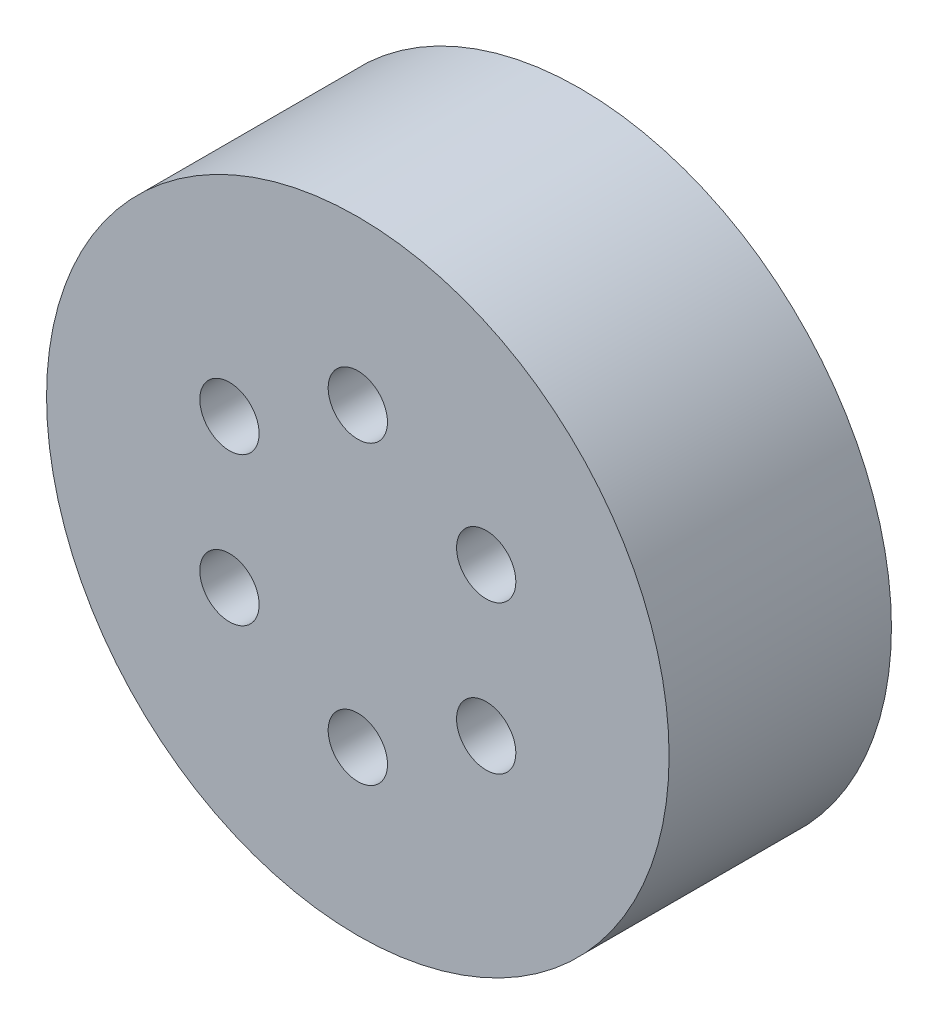
ISO-10303-21;
HEADER;
FILE_DESCRIPTION(('STEP AP214'),'2;1');
FILE_NAME('part.step','',(''),(''),'','','');
FILE_SCHEMA(('AUTOMOTIVE_DESIGN { 1 0 10303 214 1 1 1 1 }'));
ENDSEC;
DATA;
#1=APPLICATION_CONTEXT('core data for automotive mechanical design processes');
#2=APPLICATION_PROTOCOL_DEFINITION('international standard','automotive_design',2000,#1);
#3=PRODUCT_CONTEXT('',#1,'mechanical');
#4=PRODUCT('Part','Part','',(#3));
#5=PRODUCT_RELATED_PRODUCT_CATEGORY('part','',(#4));
#6=PRODUCT_DEFINITION_FORMATION('','',#4);
#7=PRODUCT_DEFINITION_CONTEXT('part definition',#1,'design');
#8=PRODUCT_DEFINITION('design','',#6,#7);
#9=PRODUCT_DEFINITION_SHAPE('','',#8);
#10=(LENGTH_UNIT() NAMED_UNIT(*) SI_UNIT(.MILLI.,.METRE.));
#11=(NAMED_UNIT(*) PLANE_ANGLE_UNIT() SI_UNIT($,.RADIAN.));
#12=(NAMED_UNIT(*) SI_UNIT($,.STERADIAN.) SOLID_ANGLE_UNIT());
#13=UNCERTAINTY_MEASURE_WITH_UNIT(LENGTH_MEASURE(1.E-05),#10,'distance_accuracy_value','');
#14=(GEOMETRIC_REPRESENTATION_CONTEXT(3) GLOBAL_UNCERTAINTY_ASSIGNED_CONTEXT((#13)) GLOBAL_UNIT_ASSIGNED_CONTEXT((#10,
#11,#12)) REPRESENTATION_CONTEXT('',''));
#15=CARTESIAN_POINT('',(0.,0.,0.));
#16=DIRECTION('',(0.,0.,1.));
#17=DIRECTION('',(1.,0.,0.));
#18=AXIS2_PLACEMENT_3D('',#15,#16,#17);
#19=CARTESIAN_POINT('',(0.,0.,15.));
#20=DIRECTION('',(0.,0.,-1.));
#21=DIRECTION('',(-1.,0.,0.));
#22=AXIS2_PLACEMENT_3D('',#19,#20,#21);
#23=CYLINDRICAL_SURFACE('',#22,21.);
#24=CARTESIAN_POINT('',(0.,0.,15.));
#25=DIRECTION('',(0.,0.,1.));
#26=DIRECTION('',(1.,0.,0.));
#27=AXIS2_PLACEMENT_3D('',#24,#25,#26);
#28=CIRCLE('',#27,21.);
#29=CARTESIAN_POINT('',(21.,0.,15.));
#30=VERTEX_POINT('',#29);
#31=EDGE_CURVE('E10',#30,#30,#28,.T.);
#32=ORIENTED_EDGE('',*,*,#31,.F.);
#33=EDGE_LOOP('',(#32));
#34=FACE_BOUND('',#33,.T.);
#35=CARTESIAN_POINT('',(0.,0.,0.));
#36=DIRECTION('',(0.,0.,1.));
#37=DIRECTION('',(1.,0.,0.));
#38=AXIS2_PLACEMENT_3D('',#35,#36,#37);
#39=CIRCLE('',#38,21.);
#40=CARTESIAN_POINT('',(21.,0.,0.));
#41=VERTEX_POINT('',#40);
#42=EDGE_CURVE('E37',#41,#41,#39,.T.);
#43=ORIENTED_EDGE('',*,*,#42,.T.);
#44=EDGE_LOOP('',(#43));
#45=FACE_BOUND('',#44,.T.);
#46=ADVANCED_FACE('F34',(#34,#45),#23,.T.);
#47=CARTESIAN_POINT('',(0.,0.,15.));
#48=DIRECTION('',(0.,0.,1.));
#49=DIRECTION('',(1.,0.,0.));
#50=AXIS2_PLACEMENT_3D('',#47,#48,#49);
#51=PLANE('',#50);
#52=CARTESIAN_POINT('',(8.6602540378446,5.00000000000037,15.));
#53=DIRECTION('',(0.,0.,1.));
#54=DIRECTION('',(1.,0.,0.));
#55=AXIS2_PLACEMENT_3D('',#52,#53,#54);
#56=CIRCLE('',#55,2.00000000000012);
#57=CARTESIAN_POINT('',(10.6602540378447,5.00000000000037,15.));
#58=VERTEX_POINT('',#57);
#59=EDGE_CURVE('E76',#58,#58,#56,.T.);
#60=ORIENTED_EDGE('',*,*,#59,.F.);
#61=EDGE_LOOP('',(#60));
#62=FACE_BOUND('',#61,.T.);
#63=CARTESIAN_POINT('',(8.66025403784503,-4.99999999999963,15.));
#64=DIRECTION('',(0.,0.,1.));
#65=DIRECTION('',(1.,0.,0.));
#66=AXIS2_PLACEMENT_3D('',#63,#64,#65);
#67=CIRCLE('',#66,2.00000000000055);
#68=CARTESIAN_POINT('',(10.6602540378456,-4.99999999999963,15.));
#69=VERTEX_POINT('',#68);
#70=EDGE_CURVE('E70',#69,#69,#67,.T.);
#71=ORIENTED_EDGE('',*,*,#70,.F.);
#72=EDGE_LOOP('',(#71));
#73=FACE_BOUND('',#72,.T.);
#74=CARTESIAN_POINT('',(8.50201989313825E-13,-10.,15.));
#75=DIRECTION('',(0.,0.,1.));
#76=DIRECTION('',(1.,0.,0.));
#77=AXIS2_PLACEMENT_3D('',#74,#75,#76);
#78=CIRCLE('',#77,2.00000000000088);
#79=CARTESIAN_POINT('',(2.00000000000173,-10.,15.));
#80=VERTEX_POINT('',#79);
#81=EDGE_CURVE('E64',#80,#80,#78,.T.);
#82=ORIENTED_EDGE('',*,*,#81,.F.);
#83=EDGE_LOOP('',(#82));
#84=FACE_BOUND('',#83,.T.);
#85=CARTESIAN_POINT('',(-8.66025403784375,-5.00000000000037,15.));
#86=DIRECTION('',(0.,0.,1.));
#87=DIRECTION('',(1.,0.,0.));
#88=AXIS2_PLACEMENT_3D('',#85,#86,#87);
#89=CIRCLE('',#88,2.00000000000081);
#90=CARTESIAN_POINT('',(-6.66025403784294,-5.00000000000037,15.));
#91=VERTEX_POINT('',#90);
#92=EDGE_CURVE('E58',#91,#91,#89,.T.);
#93=ORIENTED_EDGE('',*,*,#92,.F.);
#94=EDGE_LOOP('',(#93));
#95=FACE_BOUND('',#94,.T.);
#96=CARTESIAN_POINT('',(-8.66025403784418,4.99999999999963,15.));
#97=DIRECTION('',(0.,0.,1.));
#98=DIRECTION('',(1.,0.,0.));
#99=AXIS2_PLACEMENT_3D('',#96,#97,#98);
#100=CIRCLE('',#99,2.00000000000043);
#101=CARTESIAN_POINT('',(-6.66025403784375,4.99999999999963,15.));
#102=VERTEX_POINT('',#101);
#103=EDGE_CURVE('E52',#102,#102,#100,.T.);
#104=ORIENTED_EDGE('',*,*,#103,.F.);
#105=EDGE_LOOP('',(#104));
#106=FACE_BOUND('',#105,.T.);
#107=CARTESIAN_POINT('',(0.,10.,15.));
#108=DIRECTION('',(0.,0.,1.));
#109=DIRECTION('',(1.,0.,0.));
#110=AXIS2_PLACEMENT_3D('',#107,#108,#109);
#111=CIRCLE('',#110,2.);
#112=CARTESIAN_POINT('',(2.,10.,15.));
#113=VERTEX_POINT('',#112);
#114=EDGE_CURVE('E46',#113,#113,#111,.T.);
#115=ORIENTED_EDGE('',*,*,#114,.F.);
#116=EDGE_LOOP('',(#115));
#117=FACE_BOUND('',#116,.T.);
#118=ORIENTED_EDGE('',*,*,#31,.T.);
#119=EDGE_LOOP('',(#118));
#120=FACE_BOUND('',#119,.T.);
#121=ADVANCED_FACE('F92',(#62,#73,#84,#95,#106,#117,#120),#51,.T.);
#122=CARTESIAN_POINT('',(0.,0.,0.));
#123=DIRECTION('',(0.,0.,1.));
#124=DIRECTION('',(1.,0.,0.));
#125=AXIS2_PLACEMENT_3D('',#122,#123,#124);
#126=PLANE('',#125);
#127=CARTESIAN_POINT('',(8.6602540378446,5.00000000000037,0.));
#128=DIRECTION('',(0.,0.,1.));
#129=DIRECTION('',(1.,0.,0.));
#130=AXIS2_PLACEMENT_3D('',#127,#128,#129);
#131=CIRCLE('',#130,2.00000000000012);
#132=CARTESIAN_POINT('',(10.6602540378447,5.00000000000037,0.));
#133=VERTEX_POINT('',#132);
#134=EDGE_CURVE('E49',#133,#133,#131,.T.);
#135=ORIENTED_EDGE('',*,*,#134,.T.);
#136=EDGE_LOOP('',(#135));
#137=FACE_BOUND('',#136,.T.);
#138=CARTESIAN_POINT('',(8.66025403784503,-4.99999999999963,0.));
#139=DIRECTION('',(0.,0.,1.));
#140=DIRECTION('',(1.,0.,0.));
#141=AXIS2_PLACEMENT_3D('',#138,#139,#140);
#142=CIRCLE('',#141,2.00000000000055);
#143=CARTESIAN_POINT('',(10.6602540378456,-4.99999999999963,0.));
#144=VERTEX_POINT('',#143);
#145=EDGE_CURVE('E73',#144,#144,#142,.T.);
#146=ORIENTED_EDGE('',*,*,#145,.T.);
#147=EDGE_LOOP('',(#146));
#148=FACE_BOUND('',#147,.T.);
#149=CARTESIAN_POINT('',(8.50201989313825E-13,-10.,0.));
#150=DIRECTION('',(0.,0.,1.));
#151=DIRECTION('',(1.,0.,0.));
#152=AXIS2_PLACEMENT_3D('',#149,#150,#151);
#153=CIRCLE('',#152,2.00000000000088);
#154=CARTESIAN_POINT('',(2.00000000000173,-10.,0.));
#155=VERTEX_POINT('',#154);
#156=EDGE_CURVE('E67',#155,#155,#153,.T.);
#157=ORIENTED_EDGE('',*,*,#156,.T.);
#158=EDGE_LOOP('',(#157));
#159=FACE_BOUND('',#158,.T.);
#160=CARTESIAN_POINT('',(-8.66025403784375,-5.00000000000037,0.));
#161=DIRECTION('',(0.,0.,1.));
#162=DIRECTION('',(1.,0.,0.));
#163=AXIS2_PLACEMENT_3D('',#160,#161,#162);
#164=CIRCLE('',#163,2.00000000000081);
#165=CARTESIAN_POINT('',(-6.66025403784294,-5.00000000000037,0.));
#166=VERTEX_POINT('',#165);
#167=EDGE_CURVE('E61',#166,#166,#164,.T.);
#168=ORIENTED_EDGE('',*,*,#167,.T.);
#169=EDGE_LOOP('',(#168));
#170=FACE_BOUND('',#169,.T.);
#171=CARTESIAN_POINT('',(-8.66025403784418,4.99999999999963,0.));
#172=DIRECTION('',(0.,0.,1.));
#173=DIRECTION('',(1.,0.,0.));
#174=AXIS2_PLACEMENT_3D('',#171,#172,#173);
#175=CIRCLE('',#174,2.00000000000043);
#176=CARTESIAN_POINT('',(-6.66025403784375,4.99999999999963,0.));
#177=VERTEX_POINT('',#176);
#178=EDGE_CURVE('E55',#177,#177,#175,.T.);
#179=ORIENTED_EDGE('',*,*,#178,.T.);
#180=EDGE_LOOP('',(#179));
#181=FACE_BOUND('',#180,.T.);
#182=CARTESIAN_POINT('',(0.,10.,0.));
#183=DIRECTION('',(0.,0.,1.));
#184=DIRECTION('',(1.,0.,0.));
#185=AXIS2_PLACEMENT_3D('',#182,#183,#184);
#186=CIRCLE('',#185,2.);
#187=CARTESIAN_POINT('',(2.,10.,0.));
#188=VERTEX_POINT('',#187);
#189=EDGE_CURVE('E44',#188,#188,#186,.T.);
#190=ORIENTED_EDGE('',*,*,#189,.T.);
#191=EDGE_LOOP('',(#190));
#192=FACE_BOUND('',#191,.T.);
#193=ORIENTED_EDGE('',*,*,#42,.F.);
#194=EDGE_LOOP('',(#193));
#195=FACE_BOUND('',#194,.T.);
#196=ADVANCED_FACE('F82',(#137,#148,#159,#170,#181,#192,#195),#126,.F.);
#197=CARTESIAN_POINT('',(0.,10.,0.));
#198=DIRECTION('',(0.,0.,1.));
#199=DIRECTION('',(1.,0.,0.));
#200=AXIS2_PLACEMENT_3D('',#197,#198,#199);
#201=CYLINDRICAL_SURFACE('',#200,2.);
#202=ORIENTED_EDGE('',*,*,#189,.F.);
#203=EDGE_LOOP('',(#202));
#204=FACE_BOUND('',#203,.T.);
#205=ORIENTED_EDGE('',*,*,#114,.T.);
#206=EDGE_LOOP('',(#205));
#207=FACE_BOUND('',#206,.T.);
#208=ADVANCED_FACE('F106',(#204,#207),#201,.F.);
#209=CARTESIAN_POINT('',(-8.66025403784418,4.99999999999963,0.));
#210=DIRECTION('',(0.,0.,1.));
#211=DIRECTION('',(1.,0.,0.));
#212=AXIS2_PLACEMENT_3D('',#209,#210,#211);
#213=CYLINDRICAL_SURFACE('',#212,2.00000000000043);
#214=ORIENTED_EDGE('',*,*,#178,.F.);
#215=EDGE_LOOP('',(#214));
#216=FACE_BOUND('',#215,.T.);
#217=ORIENTED_EDGE('',*,*,#103,.T.);
#218=EDGE_LOOP('',(#217));
#219=FACE_BOUND('',#218,.T.);
#220=ADVANCED_FACE('F108',(#216,#219),#213,.F.);
#221=CARTESIAN_POINT('',(-8.66025403784375,-5.00000000000037,0.));
#222=DIRECTION('',(0.,0.,1.));
#223=DIRECTION('',(1.,0.,0.));
#224=AXIS2_PLACEMENT_3D('',#221,#222,#223);
#225=CYLINDRICAL_SURFACE('',#224,2.00000000000081);
#226=ORIENTED_EDGE('',*,*,#167,.F.);
#227=EDGE_LOOP('',(#226));
#228=FACE_BOUND('',#227,.T.);
#229=ORIENTED_EDGE('',*,*,#92,.T.);
#230=EDGE_LOOP('',(#229));
#231=FACE_BOUND('',#230,.T.);
#232=ADVANCED_FACE('F115',(#228,#231),#225,.F.);
#233=CARTESIAN_POINT('',(8.50201989313825E-13,-10.,0.));
#234=DIRECTION('',(0.,0.,1.));
#235=DIRECTION('',(1.,0.,0.));
#236=AXIS2_PLACEMENT_3D('',#233,#234,#235);
#237=CYLINDRICAL_SURFACE('',#236,2.00000000000088);
#238=ORIENTED_EDGE('',*,*,#156,.F.);
#239=EDGE_LOOP('',(#238));
#240=FACE_BOUND('',#239,.T.);
#241=ORIENTED_EDGE('',*,*,#81,.T.);
#242=EDGE_LOOP('',(#241));
#243=FACE_BOUND('',#242,.T.);
#244=ADVANCED_FACE('F153',(#240,#243),#237,.F.);
#245=CARTESIAN_POINT('',(8.66025403784503,-4.99999999999963,0.));
#246=DIRECTION('',(0.,0.,1.));
#247=DIRECTION('',(1.,0.,0.));
#248=AXIS2_PLACEMENT_3D('',#245,#246,#247);
#249=CYLINDRICAL_SURFACE('',#248,2.00000000000055);
#250=ORIENTED_EDGE('',*,*,#145,.F.);
#251=EDGE_LOOP('',(#250));
#252=FACE_BOUND('',#251,.T.);
#253=ORIENTED_EDGE('',*,*,#70,.T.);
#254=EDGE_LOOP('',(#253));
#255=FACE_BOUND('',#254,.T.);
#256=ADVANCED_FACE('F88',(#252,#255),#249,.F.);
#257=CARTESIAN_POINT('',(8.6602540378446,5.00000000000037,0.));
#258=DIRECTION('',(0.,0.,1.));
#259=DIRECTION('',(1.,0.,0.));
#260=AXIS2_PLACEMENT_3D('',#257,#258,#259);
#261=CYLINDRICAL_SURFACE('',#260,2.00000000000012);
#262=ORIENTED_EDGE('',*,*,#134,.F.);
#263=EDGE_LOOP('',(#262));
#264=FACE_BOUND('',#263,.T.);
#265=ORIENTED_EDGE('',*,*,#59,.T.);
#266=EDGE_LOOP('',(#265));
#267=FACE_BOUND('',#266,.T.);
#268=ADVANCED_FACE('F85',(#264,#267),#261,.F.);
#269=CLOSED_SHELL('',(#46,#121,#196,#208,#220,#232,#244,#256,#268));
#270=MANIFOLD_SOLID_BREP('B2',#269);
#271=ADVANCED_BREP_SHAPE_REPRESENTATION('',(#18,#270),#14);
#272=SHAPE_DEFINITION_REPRESENTATION(#9,#271);
ENDSEC;
END-ISO-10303-21;
